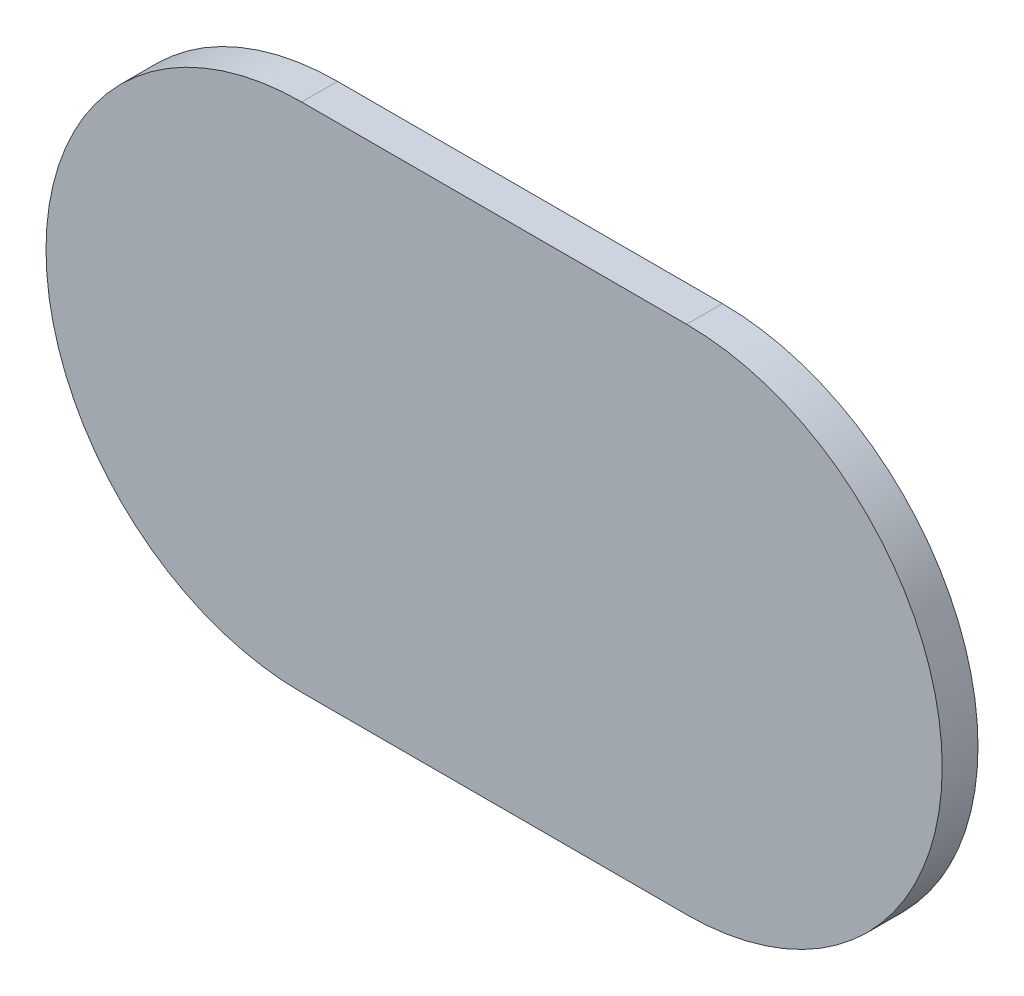
ISO-10303-21;
HEADER;
FILE_DESCRIPTION(('STEP AP214'),'2;1');
FILE_NAME('part.step','',(''),(''),'','','');
FILE_SCHEMA(('AUTOMOTIVE_DESIGN { 1 0 10303 214 1 1 1 1 }'));
ENDSEC;
DATA;
#1=APPLICATION_CONTEXT('core data for automotive mechanical design processes');
#2=APPLICATION_PROTOCOL_DEFINITION('international standard','automotive_design',2000,#1);
#3=PRODUCT_CONTEXT('',#1,'mechanical');
#4=PRODUCT('Part','Part','',(#3));
#5=PRODUCT_RELATED_PRODUCT_CATEGORY('part','',(#4));
#6=PRODUCT_DEFINITION_FORMATION('','',#4);
#7=PRODUCT_DEFINITION_CONTEXT('part definition',#1,'design');
#8=PRODUCT_DEFINITION('design','',#6,#7);
#9=PRODUCT_DEFINITION_SHAPE('','',#8);
#10=(LENGTH_UNIT() NAMED_UNIT(*) SI_UNIT(.MILLI.,.METRE.));
#11=(NAMED_UNIT(*) PLANE_ANGLE_UNIT() SI_UNIT($,.RADIAN.));
#12=(NAMED_UNIT(*) SI_UNIT($,.STERADIAN.) SOLID_ANGLE_UNIT());
#13=UNCERTAINTY_MEASURE_WITH_UNIT(LENGTH_MEASURE(1.E-05),#10,'distance_accuracy_value','');
#14=(GEOMETRIC_REPRESENTATION_CONTEXT(3) GLOBAL_UNCERTAINTY_ASSIGNED_CONTEXT((#13)) GLOBAL_UNIT_ASSIGNED_CONTEXT((#10,
#11,#12)) REPRESENTATION_CONTEXT('',''));
#15=CARTESIAN_POINT('',(0.,0.,0.));
#16=DIRECTION('',(0.,0.,1.));
#17=DIRECTION('',(1.,0.,0.));
#18=AXIS2_PLACEMENT_3D('',#15,#16,#17);
#19=CARTESIAN_POINT('',(125.724306,-115.547892,1.635));
#20=DIRECTION('',(0.,0.,1.));
#21=DIRECTION('',(1.,0.,0.));
#22=AXIS2_PLACEMENT_3D('',#19,#20,#21);
#23=PLANE('',#22);
#24=DIRECTION('',(-1.,0.,0.));
#25=VECTOR('',#24,1.);
#26=CARTESIAN_POINT('',(125.724306,-115.547892,1.635));
#27=LINE('',#26,#25);
#28=CARTESIAN_POINT('',(125.724306,-115.547892,1.635));
#29=VERTEX_POINT('',#28);
#30=CARTESIAN_POINT('',(125.347892,-115.547892,1.635));
#31=VERTEX_POINT('',#30);
#32=EDGE_CURVE('E96',#29,#31,#27,.T.);
#33=ORIENTED_EDGE('',*,*,#32,.T.);
#34=CARTESIAN_POINT('',(125.347892,-115.797892,1.635));
#35=DIRECTION('',(0.,0.,1.));
#36=DIRECTION('',(0.,1.,0.));
#37=AXIS2_PLACEMENT_3D('',#34,#35,#36);
#38=CIRCLE('',#37,0.25);
#39=CARTESIAN_POINT('',(125.347892,-116.047892,1.635));
#40=VERTEX_POINT('',#39);
#41=EDGE_CURVE('E75',#31,#40,#38,.T.);
#42=ORIENTED_EDGE('',*,*,#41,.T.);
#43=DIRECTION('',(1.,0.,0.));
#44=VECTOR('',#43,1.);
#45=CARTESIAN_POINT('',(125.347892,-116.047892,1.635));
#46=LINE('',#45,#44);
#47=CARTESIAN_POINT('',(125.724306,-116.047892,1.635));
#48=VERTEX_POINT('',#47);
#49=EDGE_CURVE('E80',#40,#48,#46,.T.);
#50=ORIENTED_EDGE('',*,*,#49,.T.);
#51=CARTESIAN_POINT('',(125.724306,-115.797892,1.635));
#52=DIRECTION('',(0.,0.,1.));
#53=DIRECTION('',(0.,-1.,0.));
#54=AXIS2_PLACEMENT_3D('',#51,#52,#53);
#55=CIRCLE('',#54,0.25);
#56=EDGE_CURVE('E11',#48,#29,#55,.T.);
#57=ORIENTED_EDGE('',*,*,#56,.T.);
#58=EDGE_LOOP('',(#33,#42,#50,#57));
#59=FACE_BOUND('',#58,.T.);
#60=ADVANCED_FACE('F17',(#59),#23,.T.);
#61=CARTESIAN_POINT('',(125.724306,-115.547892,1.6));
#62=DIRECTION('',(0.,0.,1.));
#63=DIRECTION('',(1.,0.,0.));
#64=AXIS2_PLACEMENT_3D('',#61,#62,#63);
#65=PLANE('',#64);
#66=CARTESIAN_POINT('',(125.724306,-115.797892,1.6));
#67=DIRECTION('',(0.,0.,1.));
#68=DIRECTION('',(0.,-1.,0.));
#69=AXIS2_PLACEMENT_3D('',#66,#67,#68);
#70=CIRCLE('',#69,0.25);
#71=CARTESIAN_POINT('',(125.724306,-116.047892,1.6));
#72=VERTEX_POINT('',#71);
#73=CARTESIAN_POINT('',(125.724306,-115.547892,1.6));
#74=VERTEX_POINT('',#73);
#75=EDGE_CURVE('E21',#72,#74,#70,.T.);
#76=ORIENTED_EDGE('',*,*,#75,.F.);
#77=DIRECTION('',(1.,0.,0.));
#78=VECTOR('',#77,1.);
#79=CARTESIAN_POINT('',(125.347892,-116.047892,1.6));
#80=LINE('',#79,#78);
#81=CARTESIAN_POINT('',(125.347892,-116.047892,1.6));
#82=VERTEX_POINT('',#81);
#83=EDGE_CURVE('E66',#82,#72,#80,.T.);
#84=ORIENTED_EDGE('',*,*,#83,.F.);
#85=CARTESIAN_POINT('',(125.347892,-115.797892,1.6));
#86=DIRECTION('',(0.,0.,1.));
#87=DIRECTION('',(0.,1.,0.));
#88=AXIS2_PLACEMENT_3D('',#85,#86,#87);
#89=CIRCLE('',#88,0.25);
#90=CARTESIAN_POINT('',(125.347892,-115.547892,1.6));
#91=VERTEX_POINT('',#90);
#92=EDGE_CURVE('E69',#91,#82,#89,.T.);
#93=ORIENTED_EDGE('',*,*,#92,.F.);
#94=DIRECTION('',(-1.,0.,0.));
#95=VECTOR('',#94,1.);
#96=CARTESIAN_POINT('',(125.724306,-115.547892,1.6));
#97=LINE('',#96,#95);
#98=EDGE_CURVE('E102',#74,#91,#97,.T.);
#99=ORIENTED_EDGE('',*,*,#98,.F.);
#100=EDGE_LOOP('',(#76,#84,#93,#99));
#101=FACE_BOUND('',#100,.T.);
#102=ADVANCED_FACE('F19',(#101),#65,.F.);
#103=CARTESIAN_POINT('',(125.724306,-115.797892,1.6));
#104=DIRECTION('',(0.,0.,-1.));
#105=DIRECTION('',(0.,-1.,0.));
#106=AXIS2_PLACEMENT_3D('',#103,#104,#105);
#107=CYLINDRICAL_SURFACE('',#106,0.25);
#108=ORIENTED_EDGE('',*,*,#75,.T.);
#109=DIRECTION('',(0.,0.,1.));
#110=VECTOR('',#109,1.);
#111=CARTESIAN_POINT('',(125.724306,-115.547892,1.6));
#112=LINE('',#111,#110);
#113=EDGE_CURVE('E90',#74,#29,#112,.T.);
#114=ORIENTED_EDGE('',*,*,#113,.T.);
#115=ORIENTED_EDGE('',*,*,#56,.F.);
#116=DIRECTION('',(0.,0.,1.));
#117=VECTOR('',#116,1.);
#118=CARTESIAN_POINT('',(125.724306,-116.047892,1.6));
#119=LINE('',#118,#117);
#120=EDGE_CURVE('E74',#72,#48,#119,.T.);
#121=ORIENTED_EDGE('',*,*,#120,.F.);
#122=EDGE_LOOP('',(#108,#114,#115,#121));
#123=FACE_BOUND('',#122,.T.);
#124=ADVANCED_FACE('F112',(#123),#107,.T.);
#125=CARTESIAN_POINT('',(125.347892,-116.047892,1.6));
#126=DIRECTION('',(0.,1.,0.));
#127=DIRECTION('',(1.,0.,0.));
#128=AXIS2_PLACEMENT_3D('',#125,#126,#127);
#129=PLANE('',#128);
#130=ORIENTED_EDGE('',*,*,#83,.T.);
#131=ORIENTED_EDGE('',*,*,#120,.T.);
#132=ORIENTED_EDGE('',*,*,#49,.F.);
#133=DIRECTION('',(0.,0.,1.));
#134=VECTOR('',#133,1.);
#135=CARTESIAN_POINT('',(125.347892,-116.047892,1.6));
#136=LINE('',#135,#134);
#137=EDGE_CURVE('E78',#82,#40,#136,.T.);
#138=ORIENTED_EDGE('',*,*,#137,.F.);
#139=EDGE_LOOP('',(#130,#131,#132,#138));
#140=FACE_BOUND('',#139,.T.);
#141=ADVANCED_FACE('F79',(#140),#129,.F.);
#142=CARTESIAN_POINT('',(125.347892,-115.797892,1.6));
#143=DIRECTION('',(0.,0.,-1.));
#144=DIRECTION('',(0.,1.,0.));
#145=AXIS2_PLACEMENT_3D('',#142,#143,#144);
#146=CYLINDRICAL_SURFACE('',#145,0.25);
#147=ORIENTED_EDGE('',*,*,#92,.T.);
#148=ORIENTED_EDGE('',*,*,#137,.T.);
#149=ORIENTED_EDGE('',*,*,#41,.F.);
#150=DIRECTION('',(0.,0.,1.));
#151=VECTOR('',#150,1.);
#152=CARTESIAN_POINT('',(125.347892,-115.547892,1.6));
#153=LINE('',#152,#151);
#154=EDGE_CURVE('E87',#91,#31,#153,.T.);
#155=ORIENTED_EDGE('',*,*,#154,.F.);
#156=EDGE_LOOP('',(#147,#148,#149,#155));
#157=FACE_BOUND('',#156,.T.);
#158=ADVANCED_FACE('F85',(#157),#146,.T.);
#159=CARTESIAN_POINT('',(125.724306,-115.547892,1.6));
#160=DIRECTION('',(0.,-1.,0.));
#161=DIRECTION('',(0.,0.,-1.));
#162=AXIS2_PLACEMENT_3D('',#159,#160,#161);
#163=PLANE('',#162);
#164=ORIENTED_EDGE('',*,*,#98,.T.);
#165=ORIENTED_EDGE('',*,*,#154,.T.);
#166=ORIENTED_EDGE('',*,*,#32,.F.);
#167=ORIENTED_EDGE('',*,*,#113,.F.);
#168=EDGE_LOOP('',(#164,#165,#166,#167));
#169=FACE_BOUND('',#168,.T.);
#170=ADVANCED_FACE('F119',(#169),#163,.F.);
#171=CLOSED_SHELL('',(#60,#102,#124,#141,#158,#170));
#172=MANIFOLD_SOLID_BREP('B1',#171);
#173=ADVANCED_BREP_SHAPE_REPRESENTATION('',(#18,#172),#14);
#174=SHAPE_DEFINITION_REPRESENTATION(#9,#173);
ENDSEC;
END-ISO-10303-21;
